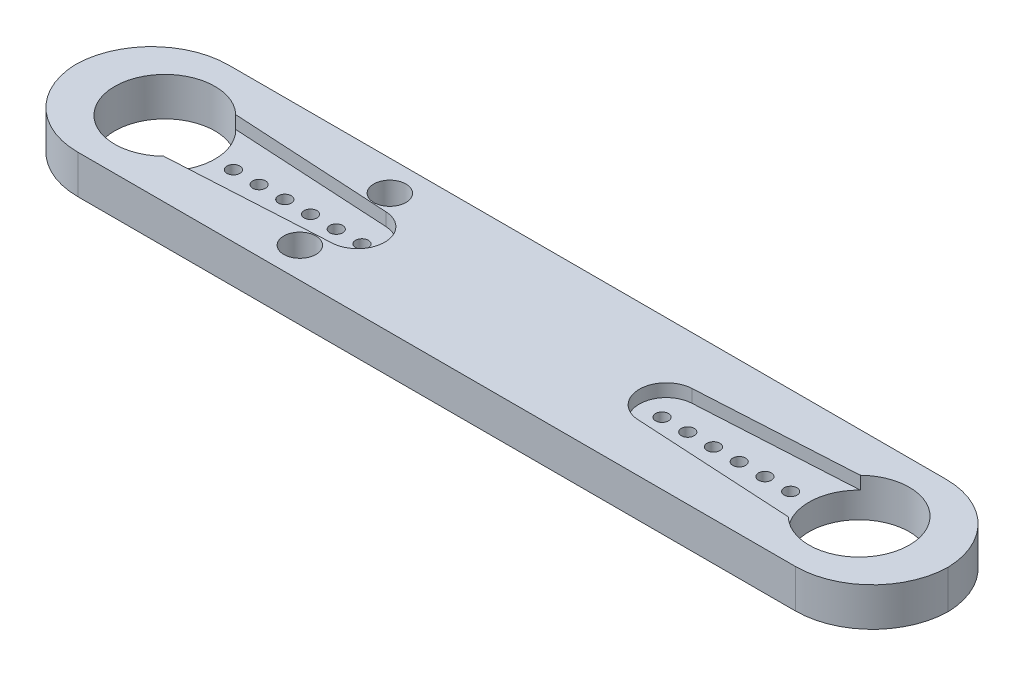
ISO-10303-21;
HEADER;
FILE_DESCRIPTION(('STEP AP214'),'2;1');
FILE_NAME('part.step','',(''),(''),'','','');
FILE_SCHEMA(('AUTOMOTIVE_DESIGN { 1 0 10303 214 1 1 1 1 }'));
ENDSEC;
DATA;
#1=APPLICATION_CONTEXT('core data for automotive mechanical design processes');
#2=APPLICATION_PROTOCOL_DEFINITION('international standard','automotive_design',2000,#1);
#3=PRODUCT_CONTEXT('',#1,'mechanical');
#4=PRODUCT('Part','Part','',(#3));
#5=PRODUCT_RELATED_PRODUCT_CATEGORY('part','',(#4));
#6=PRODUCT_DEFINITION_FORMATION('','',#4);
#7=PRODUCT_DEFINITION_CONTEXT('part definition',#1,'design');
#8=PRODUCT_DEFINITION('design','',#6,#7);
#9=PRODUCT_DEFINITION_SHAPE('','',#8);
#10=(LENGTH_UNIT() NAMED_UNIT(*) SI_UNIT(.MILLI.,.METRE.));
#11=(NAMED_UNIT(*) PLANE_ANGLE_UNIT() SI_UNIT($,.RADIAN.));
#12=(NAMED_UNIT(*) SI_UNIT($,.STERADIAN.) SOLID_ANGLE_UNIT());
#13=UNCERTAINTY_MEASURE_WITH_UNIT(LENGTH_MEASURE(1.E-05),#10,'distance_accuracy_value','');
#14=(GEOMETRIC_REPRESENTATION_CONTEXT(3) GLOBAL_UNCERTAINTY_ASSIGNED_CONTEXT((#13)) GLOBAL_UNIT_ASSIGNED_CONTEXT((#10,
#11,#12)) REPRESENTATION_CONTEXT('',''));
#15=CARTESIAN_POINT('',(0.,0.,0.));
#16=DIRECTION('',(0.,0.,1.));
#17=DIRECTION('',(1.,0.,0.));
#18=AXIS2_PLACEMENT_3D('',#15,#16,#17);
#19=CARTESIAN_POINT('',(0.106898980546491,3.,-1.89370424402151));
#20=DIRECTION('',(0.0563599445727909,0.,-0.998410515092741));
#21=DIRECTION('',(-0.998410515092741,0.,-0.0563599445727909));
#22=AXIS2_PLACEMENT_3D('',#19,#20,#21);
#23=PLANE('',#22);
#24=DIRECTION('',(0.,-1.,0.));
#25=VECTOR('',#24,1.);
#26=CARTESIAN_POINT('',(-15.948035413227,3.,-2.80000000000002));
#27=LINE('',#26,#25);
#28=CARTESIAN_POINT('',(-15.948035413227,3.,-2.80000000000002));
#29=VERTEX_POINT('',#28);
#30=CARTESIAN_POINT('',(-15.948035413227,2.,-2.80000000000002));
#31=VERTEX_POINT('',#30);
#32=EDGE_CURVE('E163',#29,#31,#27,.T.);
#33=ORIENTED_EDGE('',*,*,#32,.T.);
#34=DIRECTION('',(0.998410515092741,0.,0.0563599445727909));
#35=VECTOR('',#34,1.);
#36=CARTESIAN_POINT('',(0.106898980546491,2.,-1.89370424402151));
#37=LINE('',#36,#35);
#38=CARTESIAN_POINT('',(-3.54760872965789,2.,-2.10000000000002));
#39=VERTEX_POINT('',#38);
#40=EDGE_CURVE('E300',#31,#39,#37,.T.);
#41=ORIENTED_EDGE('',*,*,#40,.T.);
#42=DIRECTION('',(0.,-1.,0.));
#43=VECTOR('',#42,1.);
#44=CARTESIAN_POINT('',(-3.54760872965789,3.,-2.10000000000002));
#45=LINE('',#44,#43);
#46=CARTESIAN_POINT('',(-3.54760872965789,3.,-2.10000000000002));
#47=VERTEX_POINT('',#46);
#48=EDGE_CURVE('E172',#47,#39,#45,.T.);
#49=ORIENTED_EDGE('',*,*,#48,.F.);
#50=DIRECTION('',(0.998410515092741,0.,0.0563599445727909));
#51=VECTOR('',#50,1.);
#52=CARTESIAN_POINT('',(0.106898980546491,3.,-1.89370424402151));
#53=LINE('',#52,#51);
#54=EDGE_CURVE('E263',#29,#47,#53,.T.);
#55=ORIENTED_EDGE('',*,*,#54,.F.);
#56=EDGE_LOOP('',(#33,#41,#49,#55));
#57=FACE_BOUND('',#56,.T.);
#58=ADVANCED_FACE('F34',(#57),#23,.F.);
#59=CARTESIAN_POINT('',(-3.66615303764914,3.,0.));
#60=DIRECTION('',(0.,-1.,0.));
#61=DIRECTION('',(0.,0.,-1.));
#62=AXIS2_PLACEMENT_3D('',#59,#60,#61);
#63=CYLINDRICAL_SURFACE('',#62,2.10334323232259);
#64=ORIENTED_EDGE('',*,*,#48,.T.);
#65=CARTESIAN_POINT('',(-3.66615303764914,2.,0.));
#66=DIRECTION('',(0.,1.,0.));
#67=DIRECTION('',(0.,0.,1.));
#68=AXIS2_PLACEMENT_3D('',#65,#66,#67);
#69=CIRCLE('',#68,2.10334323232259);
#70=CARTESIAN_POINT('',(-3.54760872965789,2.,2.10000000000002));
#71=VERTEX_POINT('',#70);
#72=EDGE_CURVE('E302',#39,#71,#69,.F.);
#73=ORIENTED_EDGE('',*,*,#72,.T.);
#74=DIRECTION('',(0.,-1.,0.));
#75=VECTOR('',#74,1.);
#76=CARTESIAN_POINT('',(-3.54760872965789,3.,2.10000000000002));
#77=LINE('',#76,#75);
#78=CARTESIAN_POINT('',(-3.54760872965789,3.,2.10000000000002));
#79=VERTEX_POINT('',#78);
#80=EDGE_CURVE('E241',#79,#71,#77,.T.);
#81=ORIENTED_EDGE('',*,*,#80,.F.);
#82=CARTESIAN_POINT('',(-3.66615303764914,3.,0.));
#83=DIRECTION('',(0.,1.,0.));
#84=DIRECTION('',(0.,0.,1.));
#85=AXIS2_PLACEMENT_3D('',#82,#83,#84);
#86=CIRCLE('',#85,2.10334323232259);
#87=EDGE_CURVE('E261',#47,#79,#86,.F.);
#88=ORIENTED_EDGE('',*,*,#87,.F.);
#89=EDGE_LOOP('',(#64,#73,#81,#88));
#90=FACE_BOUND('',#89,.T.);
#91=ADVANCED_FACE('F399',(#90),#63,.F.);
#92=CARTESIAN_POINT('',(0.106898980546491,3.,1.89370424402151));
#93=DIRECTION('',(0.0563599445727909,0.,0.998410515092741));
#94=DIRECTION('',(0.998410515092741,0.,-0.0563599445727909));
#95=AXIS2_PLACEMENT_3D('',#92,#93,#94);
#96=PLANE('',#95);
#97=ORIENTED_EDGE('',*,*,#80,.T.);
#98=DIRECTION('',(-0.998410515092741,0.,0.0563599445727909));
#99=VECTOR('',#98,1.);
#100=CARTESIAN_POINT('',(0.106898980546491,2.,1.89370424402151));
#101=LINE('',#100,#99);
#102=CARTESIAN_POINT('',(-15.948035413227,2.,2.80000000000002));
#103=VERTEX_POINT('',#102);
#104=EDGE_CURVE('E224',#71,#103,#101,.T.);
#105=ORIENTED_EDGE('',*,*,#104,.T.);
#106=DIRECTION('',(0.,-1.,0.));
#107=VECTOR('',#106,1.);
#108=CARTESIAN_POINT('',(-15.948035413227,3.,2.80000000000002));
#109=LINE('',#108,#107);
#110=CARTESIAN_POINT('',(-15.948035413227,3.,2.80000000000002));
#111=VERTEX_POINT('',#110);
#112=EDGE_CURVE('E238',#111,#103,#109,.T.);
#113=ORIENTED_EDGE('',*,*,#112,.F.);
#114=DIRECTION('',(-0.998410515092741,0.,0.0563599445727909));
#115=VECTOR('',#114,1.);
#116=CARTESIAN_POINT('',(0.106898980546491,3.,1.89370424402151));
#117=LINE('',#116,#115);
#118=EDGE_CURVE('E259',#79,#111,#117,.T.);
#119=ORIENTED_EDGE('',*,*,#118,.F.);
#120=EDGE_LOOP('',(#97,#105,#113,#119));
#121=FACE_BOUND('',#120,.T.);
#122=ADVANCED_FACE('F405',(#121),#96,.F.);
#123=CARTESIAN_POINT('',(0.,3.,-5.86615357924814));
#124=DIRECTION('',(0.,0.,-1.));
#125=DIRECTION('',(-1.,0.,0.));
#126=AXIS2_PLACEMENT_3D('',#123,#124,#125);
#127=PLANE('',#126);
#128=DIRECTION('',(1.,0.,0.));
#129=VECTOR('',#128,1.);
#130=CARTESIAN_POINT('',(0.,3.,-5.86615357924814));
#131=LINE('',#130,#129);
#132=CARTESIAN_POINT('',(-19.5628098053266,3.,-5.86615357924814));
#133=VERTEX_POINT('',#132);
#134=CARTESIAN_POINT('',(36.2371901946734,3.,-5.86615357924814));
#135=VERTEX_POINT('',#134);
#136=EDGE_CURVE('E268',#133,#135,#131,.T.);
#137=ORIENTED_EDGE('',*,*,#136,.T.);
#138=DIRECTION('',(0.,-1.,0.));
#139=VECTOR('',#138,1.);
#140=CARTESIAN_POINT('',(36.2371901946734,3.,-5.86615357924814));
#141=LINE('',#140,#139);
#142=CARTESIAN_POINT('',(36.2371901946734,0.,-5.86615357924814));
#143=VERTEX_POINT('',#142);
#144=EDGE_CURVE('E171',#135,#143,#141,.T.);
#145=ORIENTED_EDGE('',*,*,#144,.T.);
#146=DIRECTION('',(1.,0.,0.));
#147=VECTOR('',#146,1.);
#148=CARTESIAN_POINT('',(0.,0.,-5.86615357924814));
#149=LINE('',#148,#147);
#150=CARTESIAN_POINT('',(-19.5628098053266,0.,-5.86615357924814));
#151=VERTEX_POINT('',#150);
#152=EDGE_CURVE('E211',#151,#143,#149,.T.);
#153=ORIENTED_EDGE('',*,*,#152,.F.);
#154=DIRECTION('',(0.,-1.,0.));
#155=VECTOR('',#154,1.);
#156=CARTESIAN_POINT('',(-19.5628098053266,3.,-5.86615357924814));
#157=LINE('',#156,#155);
#158=EDGE_CURVE('E169',#151,#133,#157,.F.);
#159=ORIENTED_EDGE('',*,*,#158,.T.);
#160=EDGE_LOOP('',(#137,#145,#153,#159));
#161=FACE_BOUND('',#160,.T.);
#162=ADVANCED_FACE('F215',(#161),#127,.T.);
#163=CARTESIAN_POINT('',(-0.0539337558058955,3.,-0.955430835200775));
#164=DIRECTION('',(0.0563599445727901,0.,0.998410515092741));
#165=DIRECTION('',(0.998410515092741,0.,-0.0563599445727901));
#166=AXIS2_PLACEMENT_3D('',#163,#164,#165);
#167=PLANE('',#166);
#168=DIRECTION('',(-0.998410515092741,0.,0.0563599445727901));
#169=VECTOR('',#168,1.);
#170=CARTESIAN_POINT('',(-0.0539337558058955,2.,-0.955430835200775));
#171=LINE('',#170,#169);
#172=CARTESIAN_POINT('',(32.6224158025738,2.,-2.80000000000001));
#173=VERTEX_POINT('',#172);
#174=CARTESIAN_POINT('',(20.2219891190047,2.,-2.10000000000003));
#175=VERTEX_POINT('',#174);
#176=EDGE_CURVE('E147',#173,#175,#171,.T.);
#177=ORIENTED_EDGE('',*,*,#176,.F.);
#178=DIRECTION('',(0.,-1.,0.));
#179=VECTOR('',#178,1.);
#180=CARTESIAN_POINT('',(32.6224158025738,3.,-2.80000000000001));
#181=LINE('',#180,#179);
#182=CARTESIAN_POINT('',(32.6224158025738,3.,-2.80000000000001));
#183=VERTEX_POINT('',#182);
#184=EDGE_CURVE('E144',#183,#173,#181,.T.);
#185=ORIENTED_EDGE('',*,*,#184,.F.);
#186=DIRECTION('',(-0.998410515092741,0.,0.0563599445727901));
#187=VECTOR('',#186,1.);
#188=CARTESIAN_POINT('',(-0.0539337558058955,3.,-0.955430835200775));
#189=LINE('',#188,#187);
#190=CARTESIAN_POINT('',(20.2219891190047,3.,-2.10000000000003));
#191=VERTEX_POINT('',#190);
#192=EDGE_CURVE('E236',#183,#191,#189,.T.);
#193=ORIENTED_EDGE('',*,*,#192,.T.);
#194=DIRECTION('',(0.,-1.,0.));
#195=VECTOR('',#194,1.);
#196=CARTESIAN_POINT('',(20.2219891190047,3.,-2.10000000000003));
#197=LINE('',#196,#195);
#198=EDGE_CURVE('E165',#191,#175,#197,.T.);
#199=ORIENTED_EDGE('',*,*,#198,.T.);
#200=EDGE_LOOP('',(#177,#185,#193,#199));
#201=FACE_BOUND('',#200,.T.);
#202=ADVANCED_FACE('F418',(#201),#167,.T.);
#203=CARTESIAN_POINT('',(35.3371901946734,3.,0.));
#204=DIRECTION('',(0.,-1.,0.));
#205=DIRECTION('',(0.,0.,-1.));
#206=AXIS2_PLACEMENT_3D('',#203,#204,#205);
#207=CYLINDRICAL_SURFACE('',#206,3.9);
#208=CARTESIAN_POINT('',(35.3371901946734,0.,0.));
#209=DIRECTION('',(0.,1.,0.));
#210=DIRECTION('',(0.,0.,1.));
#211=AXIS2_PLACEMENT_3D('',#208,#209,#210);
#212=CIRCLE('',#211,3.9);
#213=CARTESIAN_POINT('',(35.3371901946734,0.,3.89999999999999));
#214=VERTEX_POINT('',#213);
#215=EDGE_CURVE('E218',#214,#214,#212,.F.);
#216=ORIENTED_EDGE('',*,*,#215,.T.);
#217=EDGE_LOOP('',(#216));
#218=FACE_BOUND('',#217,.T.);
#219=ORIENTED_EDGE('',*,*,#184,.T.);
#220=CARTESIAN_POINT('',(35.3371901946734,2.,0.));
#221=DIRECTION('',(0.,1.,0.));
#222=DIRECTION('',(0.,0.,1.));
#223=AXIS2_PLACEMENT_3D('',#220,#221,#222);
#224=CIRCLE('',#223,3.9);
#225=CARTESIAN_POINT('',(32.6224158025738,2.,2.80000000000001));
#226=VERTEX_POINT('',#225);
#227=EDGE_CURVE('E137',#226,#173,#224,.F.);
#228=ORIENTED_EDGE('',*,*,#227,.F.);
#229=DIRECTION('',(0.,-1.,0.));
#230=VECTOR('',#229,1.);
#231=CARTESIAN_POINT('',(32.6224158025738,3.,2.80000000000001));
#232=LINE('',#231,#230);
#233=CARTESIAN_POINT('',(32.6224158025738,3.,2.80000000000001));
#234=VERTEX_POINT('',#233);
#235=EDGE_CURVE('E142',#234,#226,#232,.T.);
#236=ORIENTED_EDGE('',*,*,#235,.F.);
#237=CARTESIAN_POINT('',(35.3371901946734,3.,0.));
#238=DIRECTION('',(0.,1.,0.));
#239=DIRECTION('',(0.,0.,1.));
#240=AXIS2_PLACEMENT_3D('',#237,#238,#239);
#241=CIRCLE('',#240,3.9);
#242=EDGE_CURVE('E274',#183,#234,#241,.F.);
#243=ORIENTED_EDGE('',*,*,#242,.F.);
#244=EDGE_LOOP('',(#219,#228,#236,#243));
#245=FACE_BOUND('',#244,.T.);
#246=ADVANCED_FACE('F139',(#218,#245),#207,.F.);
#247=CARTESIAN_POINT('',(-0.0539337558058955,3.,0.955430835200775));
#248=DIRECTION('',(0.0563599445727901,0.,-0.998410515092741));
#249=DIRECTION('',(-0.998410515092741,0.,-0.0563599445727901));
#250=AXIS2_PLACEMENT_3D('',#247,#248,#249);
#251=PLANE('',#250);
#252=DIRECTION('',(0.998410515092741,0.,0.0563599445727901));
#253=VECTOR('',#252,1.);
#254=CARTESIAN_POINT('',(-0.0539337558058955,2.,0.955430835200775));
#255=LINE('',#254,#253);
#256=CARTESIAN_POINT('',(20.2219891190047,2.,2.10000000000003));
#257=VERTEX_POINT('',#256);
#258=EDGE_CURVE('E148',#257,#226,#255,.T.);
#259=ORIENTED_EDGE('',*,*,#258,.F.);
#260=DIRECTION('',(0.,-1.,0.));
#261=VECTOR('',#260,1.);
#262=CARTESIAN_POINT('',(20.2219891190047,3.,2.10000000000003));
#263=LINE('',#262,#261);
#264=CARTESIAN_POINT('',(20.2219891190047,3.,2.10000000000003));
#265=VERTEX_POINT('',#264);
#266=EDGE_CURVE('E161',#265,#257,#263,.T.);
#267=ORIENTED_EDGE('',*,*,#266,.F.);
#268=DIRECTION('',(0.998410515092741,0.,0.0563599445727901));
#269=VECTOR('',#268,1.);
#270=CARTESIAN_POINT('',(-0.0539337558058955,3.,0.955430835200775));
#271=LINE('',#270,#269);
#272=EDGE_CURVE('E160',#265,#234,#271,.T.);
#273=ORIENTED_EDGE('',*,*,#272,.T.);
#274=ORIENTED_EDGE('',*,*,#235,.T.);
#275=EDGE_LOOP('',(#259,#267,#273,#274));
#276=FACE_BOUND('',#275,.T.);
#277=ADVANCED_FACE('F158',(#276),#251,.T.);
#278=CARTESIAN_POINT('',(-4.66280980532662,3.,-3.5));
#279=DIRECTION('',(0.,-1.,0.));
#280=DIRECTION('',(0.,0.,-1.));
#281=AXIS2_PLACEMENT_3D('',#278,#279,#280);
#282=CYLINDRICAL_SURFACE('',#281,1.25);
#283=CARTESIAN_POINT('',(-4.66280980532662,3.,-3.5));
#284=DIRECTION('',(0.,1.,0.));
#285=DIRECTION('',(0.,0.,1.));
#286=AXIS2_PLACEMENT_3D('',#283,#284,#285);
#287=CIRCLE('',#286,1.25);
#288=CARTESIAN_POINT('',(-4.66280980532662,3.,-2.25));
#289=VERTEX_POINT('',#288);
#290=EDGE_CURVE('E250',#289,#289,#287,.T.);
#291=ORIENTED_EDGE('',*,*,#290,.T.);
#292=EDGE_LOOP('',(#291));
#293=FACE_BOUND('',#292,.T.);
#294=CARTESIAN_POINT('',(-4.66280980532662,0.,-3.5));
#295=DIRECTION('',(0.,1.,0.));
#296=DIRECTION('',(0.,0.,1.));
#297=AXIS2_PLACEMENT_3D('',#294,#295,#296);
#298=CIRCLE('',#297,1.25);
#299=CARTESIAN_POINT('',(-4.66280980532662,0.,-2.25));
#300=VERTEX_POINT('',#299);
#301=EDGE_CURVE('E230',#300,#300,#298,.T.);
#302=ORIENTED_EDGE('',*,*,#301,.F.);
#303=EDGE_LOOP('',(#302));
#304=FACE_BOUND('',#303,.T.);
#305=ADVANCED_FACE('F425',(#293,#304),#282,.F.);
#306=CARTESIAN_POINT('',(-18.6628098053266,3.,0.));
#307=DIRECTION('',(0.,-1.,0.));
#308=DIRECTION('',(0.,0.,-1.));
#309=AXIS2_PLACEMENT_3D('',#306,#307,#308);
#310=CYLINDRICAL_SURFACE('',#309,3.9);
#311=CARTESIAN_POINT('',(-18.6628098053266,0.,0.));
#312=DIRECTION('',(0.,1.,0.));
#313=DIRECTION('',(0.,0.,1.));
#314=AXIS2_PLACEMENT_3D('',#311,#312,#313);
#315=CIRCLE('',#314,3.9);
#316=CARTESIAN_POINT('',(-18.6628098053266,0.,3.9));
#317=VERTEX_POINT('',#316);
#318=EDGE_CURVE('E221',#317,#317,#315,.T.);
#319=ORIENTED_EDGE('',*,*,#318,.F.);
#320=EDGE_LOOP('',(#319));
#321=FACE_BOUND('',#320,.T.);
#322=CARTESIAN_POINT('',(-18.6628098053266,2.,0.));
#323=DIRECTION('',(0.,1.,0.));
#324=DIRECTION('',(0.,0.,1.));
#325=AXIS2_PLACEMENT_3D('',#322,#323,#324);
#326=CIRCLE('',#325,3.9);
#327=EDGE_CURVE('E297',#103,#31,#326,.T.);
#328=ORIENTED_EDGE('',*,*,#327,.T.);
#329=ORIENTED_EDGE('',*,*,#32,.F.);
#330=CARTESIAN_POINT('',(-18.6628098053266,3.,0.));
#331=DIRECTION('',(0.,1.,0.));
#332=DIRECTION('',(0.,0.,1.));
#333=AXIS2_PLACEMENT_3D('',#330,#331,#332);
#334=CIRCLE('',#333,3.9);
#335=EDGE_CURVE('E254',#29,#111,#334,.T.);
#336=ORIENTED_EDGE('',*,*,#335,.T.);
#337=ORIENTED_EDGE('',*,*,#112,.T.);
#338=EDGE_LOOP('',(#328,#329,#336,#337));
#339=FACE_BOUND('',#338,.T.);
#340=ADVANCED_FACE('F414',(#321,#339),#310,.F.);
#341=CARTESIAN_POINT('',(0.,3.,5.86615357924815));
#342=DIRECTION('',(0.,0.,-1.));
#343=DIRECTION('',(-1.,0.,0.));
#344=AXIS2_PLACEMENT_3D('',#341,#342,#343);
#345=PLANE('',#344);
#346=DIRECTION('',(1.,0.,0.));
#347=VECTOR('',#346,1.);
#348=CARTESIAN_POINT('',(0.,0.,5.86615357924815));
#349=LINE('',#348,#347);
#350=CARTESIAN_POINT('',(-19.5628098053266,0.,5.86615357924815));
#351=VERTEX_POINT('',#350);
#352=CARTESIAN_POINT('',(36.2371901946734,0.,5.86615357924813));
#353=VERTEX_POINT('',#352);
#354=EDGE_CURVE('E217',#351,#353,#349,.T.);
#355=ORIENTED_EDGE('',*,*,#354,.T.);
#356=DIRECTION('',(0.,-1.,0.));
#357=VECTOR('',#356,1.);
#358=CARTESIAN_POINT('',(36.2371901946734,3.,5.86615357924813));
#359=LINE('',#358,#357);
#360=CARTESIAN_POINT('',(36.2371901946734,3.,5.86615357924813));
#361=VERTEX_POINT('',#360);
#362=EDGE_CURVE('E11',#353,#361,#359,.F.);
#363=ORIENTED_EDGE('',*,*,#362,.T.);
#364=DIRECTION('',(1.,0.,0.));
#365=VECTOR('',#364,1.);
#366=CARTESIAN_POINT('',(0.,3.,5.86615357924815));
#367=LINE('',#366,#365);
#368=CARTESIAN_POINT('',(-19.5628098053266,3.,5.86615357924815));
#369=VERTEX_POINT('',#368);
#370=EDGE_CURVE('E266',#369,#361,#367,.T.);
#371=ORIENTED_EDGE('',*,*,#370,.F.);
#372=DIRECTION('',(0.,-1.,0.));
#373=VECTOR('',#372,1.);
#374=CARTESIAN_POINT('',(-19.5628098053266,3.,5.86615357924815));
#375=LINE('',#374,#373);
#376=EDGE_CURVE('E43',#369,#351,#375,.T.);
#377=ORIENTED_EDGE('',*,*,#376,.T.);
#378=EDGE_LOOP('',(#355,#363,#371,#377));
#379=FACE_BOUND('',#378,.T.);
#380=ADVANCED_FACE('F410',(#379),#345,.F.);
#381=CARTESIAN_POINT('',(20.3405334269959,3.,0.));
#382=DIRECTION('',(0.,-1.,0.));
#383=DIRECTION('',(0.,0.,-1.));
#384=AXIS2_PLACEMENT_3D('',#381,#382,#383);
#385=CYLINDRICAL_SURFACE('',#384,2.10334323232259);
#386=CARTESIAN_POINT('',(20.3405334269959,2.,0.));
#387=DIRECTION('',(0.,1.,0.));
#388=DIRECTION('',(0.,0.,1.));
#389=AXIS2_PLACEMENT_3D('',#386,#387,#388);
#390=CIRCLE('',#389,2.10334323232259);
#391=EDGE_CURVE('E153',#175,#257,#390,.T.);
#392=ORIENTED_EDGE('',*,*,#391,.F.);
#393=ORIENTED_EDGE('',*,*,#198,.F.);
#394=CARTESIAN_POINT('',(20.3405334269959,3.,0.));
#395=DIRECTION('',(0.,1.,0.));
#396=DIRECTION('',(0.,0.,1.));
#397=AXIS2_PLACEMENT_3D('',#394,#395,#396);
#398=CIRCLE('',#397,2.10334323232259);
#399=EDGE_CURVE('E270',#191,#265,#398,.T.);
#400=ORIENTED_EDGE('',*,*,#399,.T.);
#401=ORIENTED_EDGE('',*,*,#266,.T.);
#402=EDGE_LOOP('',(#392,#393,#400,#401));
#403=FACE_BOUND('',#402,.T.);
#404=ADVANCED_FACE('F413',(#403),#385,.F.);
#405=CARTESIAN_POINT('',(-4.66280980532661,3.,3.5));
#406=DIRECTION('',(0.,-1.,0.));
#407=DIRECTION('',(0.,0.,-1.));
#408=AXIS2_PLACEMENT_3D('',#405,#406,#407);
#409=CYLINDRICAL_SURFACE('',#408,1.25);
#410=CARTESIAN_POINT('',(-4.66280980532661,3.,3.5));
#411=DIRECTION('',(0.,1.,0.));
#412=DIRECTION('',(0.,0.,1.));
#413=AXIS2_PLACEMENT_3D('',#410,#411,#412);
#414=CIRCLE('',#413,1.25);
#415=CARTESIAN_POINT('',(-4.66280980532661,3.,4.75));
#416=VERTEX_POINT('',#415);
#417=EDGE_CURVE('E246',#416,#416,#414,.F.);
#418=ORIENTED_EDGE('',*,*,#417,.F.);
#419=EDGE_LOOP('',(#418));
#420=FACE_BOUND('',#419,.T.);
#421=CARTESIAN_POINT('',(-4.66280980532661,0.,3.5));
#422=DIRECTION('',(0.,1.,0.));
#423=DIRECTION('',(0.,0.,1.));
#424=AXIS2_PLACEMENT_3D('',#421,#422,#423);
#425=CIRCLE('',#424,1.25);
#426=CARTESIAN_POINT('',(-4.66280980532661,0.,4.75));
#427=VERTEX_POINT('',#426);
#428=EDGE_CURVE('E233',#427,#427,#425,.F.);
#429=ORIENTED_EDGE('',*,*,#428,.T.);
#430=EDGE_LOOP('',(#429));
#431=FACE_BOUND('',#430,.T.);
#432=ADVANCED_FACE('F421',(#420,#431),#409,.F.);
#433=CARTESIAN_POINT('',(0.,3.,0.));
#434=DIRECTION('',(0.,1.,0.));
#435=DIRECTION('',(0.,0.,1.));
#436=AXIS2_PLACEMENT_3D('',#433,#434,#435);
#437=PLANE('',#436);
#438=ORIENTED_EDGE('',*,*,#192,.F.);
#439=ORIENTED_EDGE('',*,*,#242,.T.);
#440=ORIENTED_EDGE('',*,*,#272,.F.);
#441=ORIENTED_EDGE('',*,*,#399,.F.);
#442=EDGE_LOOP('',(#438,#439,#440,#441));
#443=FACE_BOUND('',#442,.T.);
#444=CARTESIAN_POINT('',(36.2371901946734,3.,-0.133846420751873));
#445=DIRECTION('',(0.,1.,0.));
#446=DIRECTION('',(0.,0.,1.));
#447=AXIS2_PLACEMENT_3D('',#444,#445,#446);
#448=CIRCLE('',#447,6.);
#449=CARTESIAN_POINT('',(42.2356971035343,3.,0.));
#450=VERTEX_POINT('',#449);
#451=EDGE_CURVE('E51',#361,#450,#448,.T.);
#452=ORIENTED_EDGE('',*,*,#451,.T.);
#453=CARTESIAN_POINT('',(36.2371901946734,3.,0.133846420751856));
#454=DIRECTION('',(0.,1.,0.));
#455=DIRECTION('',(0.,0.,1.));
#456=AXIS2_PLACEMENT_3D('',#453,#454,#455);
#457=CIRCLE('',#456,6.);
#458=EDGE_CURVE('E187',#450,#135,#457,.T.);
#459=ORIENTED_EDGE('',*,*,#458,.T.);
#460=ORIENTED_EDGE('',*,*,#136,.F.);
#461=CARTESIAN_POINT('',(-19.5628098053266,3.,0.133846420751863));
#462=DIRECTION('',(0.,1.,0.));
#463=DIRECTION('',(0.,0.,1.));
#464=AXIS2_PLACEMENT_3D('',#461,#462,#463);
#465=CIRCLE('',#464,6.);
#466=CARTESIAN_POINT('',(-25.5613167141875,3.,0.));
#467=VERTEX_POINT('',#466);
#468=EDGE_CURVE('E58',#133,#467,#465,.T.);
#469=ORIENTED_EDGE('',*,*,#468,.T.);
#470=CARTESIAN_POINT('',(-19.5628098053266,3.,-0.133846420751846));
#471=DIRECTION('',(0.,1.,0.));
#472=DIRECTION('',(0.,0.,1.));
#473=AXIS2_PLACEMENT_3D('',#470,#471,#472);
#474=CIRCLE('',#473,6.);
#475=EDGE_CURVE('E184',#467,#369,#474,.T.);
#476=ORIENTED_EDGE('',*,*,#475,.T.);
#477=ORIENTED_EDGE('',*,*,#370,.T.);
#478=EDGE_LOOP('',(#452,#459,#460,#469,#476,#477));
#479=FACE_BOUND('',#478,.T.);
#480=ORIENTED_EDGE('',*,*,#54,.T.);
#481=ORIENTED_EDGE('',*,*,#87,.T.);
#482=ORIENTED_EDGE('',*,*,#118,.T.);
#483=ORIENTED_EDGE('',*,*,#335,.F.);
#484=EDGE_LOOP('',(#480,#481,#482,#483));
#485=FACE_BOUND('',#484,.T.);
#486=ORIENTED_EDGE('',*,*,#290,.F.);
#487=EDGE_LOOP('',(#486));
#488=FACE_BOUND('',#487,.T.);
#489=ORIENTED_EDGE('',*,*,#417,.T.);
#490=EDGE_LOOP('',(#489));
#491=FACE_BOUND('',#490,.T.);
#492=ADVANCED_FACE('F367',(#443,#479,#485,#488,#491),#437,.T.);
#493=CARTESIAN_POINT('',(0.,0.,0.));
#494=DIRECTION('',(0.,1.,0.));
#495=DIRECTION('',(0.,0.,1.));
#496=AXIS2_PLACEMENT_3D('',#493,#494,#495);
#497=PLANE('',#496);
#498=ORIENTED_EDGE('',*,*,#215,.F.);
#499=EDGE_LOOP('',(#498));
#500=FACE_BOUND('',#499,.T.);
#501=ORIENTED_EDGE('',*,*,#152,.T.);
#502=CARTESIAN_POINT('',(36.2371901946734,0.,0.133846420751856));
#503=DIRECTION('',(0.,1.,0.));
#504=DIRECTION('',(0.,0.,1.));
#505=AXIS2_PLACEMENT_3D('',#502,#503,#504);
#506=CIRCLE('',#505,6.);
#507=CARTESIAN_POINT('',(42.2356971035343,0.,0.));
#508=VERTEX_POINT('',#507);
#509=EDGE_CURVE('E181',#143,#508,#506,.F.);
#510=ORIENTED_EDGE('',*,*,#509,.T.);
#511=CARTESIAN_POINT('',(36.2371901946734,0.,-0.133846420751873));
#512=DIRECTION('',(0.,1.,0.));
#513=DIRECTION('',(0.,0.,1.));
#514=AXIS2_PLACEMENT_3D('',#511,#512,#513);
#515=CIRCLE('',#514,6.);
#516=EDGE_CURVE('E179',#508,#353,#515,.F.);
#517=ORIENTED_EDGE('',*,*,#516,.T.);
#518=ORIENTED_EDGE('',*,*,#354,.F.);
#519=CARTESIAN_POINT('',(-19.5628098053266,0.,-0.133846420751846));
#520=DIRECTION('',(0.,1.,0.));
#521=DIRECTION('',(0.,0.,1.));
#522=AXIS2_PLACEMENT_3D('',#519,#520,#521);
#523=CIRCLE('',#522,6.);
#524=CARTESIAN_POINT('',(-25.5613167141875,0.,0.));
#525=VERTEX_POINT('',#524);
#526=EDGE_CURVE('E177',#351,#525,#523,.F.);
#527=ORIENTED_EDGE('',*,*,#526,.T.);
#528=CARTESIAN_POINT('',(-19.5628098053266,0.,0.133846420751863));
#529=DIRECTION('',(0.,1.,0.));
#530=DIRECTION('',(0.,0.,1.));
#531=AXIS2_PLACEMENT_3D('',#528,#529,#530);
#532=CIRCLE('',#531,6.);
#533=EDGE_CURVE('E175',#525,#151,#532,.F.);
#534=ORIENTED_EDGE('',*,*,#533,.T.);
#535=EDGE_LOOP('',(#501,#510,#517,#518,#527,#534));
#536=FACE_BOUND('',#535,.T.);
#537=ORIENTED_EDGE('',*,*,#318,.T.);
#538=EDGE_LOOP('',(#537));
#539=FACE_BOUND('',#538,.T.);
#540=ORIENTED_EDGE('',*,*,#301,.T.);
#541=EDGE_LOOP('',(#540));
#542=FACE_BOUND('',#541,.T.);
#543=ORIENTED_EDGE('',*,*,#428,.F.);
#544=EDGE_LOOP('',(#543));
#545=FACE_BOUND('',#544,.T.);
#546=CARTESIAN_POINT('',(-13.3314008037869,0.,0.));
#547=DIRECTION('',(0.,1.,0.));
#548=DIRECTION('',(0.,0.,1.));
#549=AXIS2_PLACEMENT_3D('',#546,#547,#548);
#550=CIRCLE('',#549,0.500000000000001);
#551=CARTESIAN_POINT('',(-13.3314008037869,0.,0.500000000000071));
#552=VERTEX_POINT('',#551);
#553=EDGE_CURVE('E293',#552,#552,#550,.T.);
#554=ORIENTED_EDGE('',*,*,#553,.T.);
#555=EDGE_LOOP('',(#554));
#556=FACE_BOUND('',#555,.T.);
#557=CARTESIAN_POINT('',(-11.3314008037869,0.,0.));
#558=DIRECTION('',(0.,1.,0.));
#559=DIRECTION('',(0.,0.,1.));
#560=AXIS2_PLACEMENT_3D('',#557,#558,#559);
#561=CIRCLE('',#560,0.500000000000001);
#562=CARTESIAN_POINT('',(-11.3314008037869,0.,0.500000000000057));
#563=VERTEX_POINT('',#562);
#564=EDGE_CURVE('E290',#563,#563,#561,.T.);
#565=ORIENTED_EDGE('',*,*,#564,.T.);
#566=EDGE_LOOP('',(#565));
#567=FACE_BOUND('',#566,.T.);
#568=CARTESIAN_POINT('',(-9.3314008037869,0.,0.));
#569=DIRECTION('',(0.,1.,0.));
#570=DIRECTION('',(0.,0.,1.));
#571=AXIS2_PLACEMENT_3D('',#568,#569,#570);
#572=CIRCLE('',#571,0.500000000000001);
#573=CARTESIAN_POINT('',(-9.3314008037869,0.,0.500000000000043));
#574=VERTEX_POINT('',#573);
#575=EDGE_CURVE('E287',#574,#574,#572,.T.);
#576=ORIENTED_EDGE('',*,*,#575,.T.);
#577=EDGE_LOOP('',(#576));
#578=FACE_BOUND('',#577,.T.);
#579=CARTESIAN_POINT('',(-7.3314008037869,0.,0.));
#580=DIRECTION('',(0.,1.,0.));
#581=DIRECTION('',(0.,0.,1.));
#582=AXIS2_PLACEMENT_3D('',#579,#580,#581);
#583=CIRCLE('',#582,0.500000000000001);
#584=CARTESIAN_POINT('',(-7.3314008037869,0.,0.500000000000029));
#585=VERTEX_POINT('',#584);
#586=EDGE_CURVE('E284',#585,#585,#583,.T.);
#587=ORIENTED_EDGE('',*,*,#586,.T.);
#588=EDGE_LOOP('',(#587));
#589=FACE_BOUND('',#588,.T.);
#590=CARTESIAN_POINT('',(-5.3314008037869,0.,0.));
#591=DIRECTION('',(0.,1.,0.));
#592=DIRECTION('',(0.,0.,1.));
#593=AXIS2_PLACEMENT_3D('',#590,#591,#592);
#594=CIRCLE('',#593,0.5);
#595=CARTESIAN_POINT('',(-5.3314008037869,0.,0.500000000000014));
#596=VERTEX_POINT('',#595);
#597=EDGE_CURVE('E281',#596,#596,#594,.T.);
#598=ORIENTED_EDGE('',*,*,#597,.T.);
#599=EDGE_LOOP('',(#598));
#600=FACE_BOUND('',#599,.T.);
#601=CARTESIAN_POINT('',(-3.3314008037869,0.,0.));
#602=DIRECTION('',(0.,1.,0.));
#603=DIRECTION('',(0.,0.,1.));
#604=AXIS2_PLACEMENT_3D('',#601,#602,#603);
#605=CIRCLE('',#604,0.5);
#606=CARTESIAN_POINT('',(-3.3314008037869,0.,0.5));
#607=VERTEX_POINT('',#606);
#608=EDGE_CURVE('E277',#607,#607,#605,.T.);
#609=ORIENTED_EDGE('',*,*,#608,.T.);
#610=EDGE_LOOP('',(#609));
#611=FACE_BOUND('',#610,.T.);
#612=CARTESIAN_POINT('',(20.0057811931337,0.,0.));
#613=DIRECTION('',(0.,1.,0.));
#614=DIRECTION('',(0.,0.,1.));
#615=AXIS2_PLACEMENT_3D('',#612,#613,#614);
#616=CIRCLE('',#615,0.499999999999999);
#617=CARTESIAN_POINT('',(20.0057811931337,0.,0.499999999999996));
#618=VERTEX_POINT('',#617);
#619=EDGE_CURVE('E192',#618,#618,#616,.F.);
#620=ORIENTED_EDGE('',*,*,#619,.F.);
#621=EDGE_LOOP('',(#620));
#622=FACE_BOUND('',#621,.T.);
#623=CARTESIAN_POINT('',(24.0057811931337,0.,0.));
#624=DIRECTION('',(0.,1.,0.));
#625=DIRECTION('',(0.,0.,1.));
#626=AXIS2_PLACEMENT_3D('',#623,#624,#625);
#627=CIRCLE('',#626,0.499999999999995);
#628=CARTESIAN_POINT('',(24.0057811931337,0.,0.500000000000019));
#629=VERTEX_POINT('',#628);
#630=EDGE_CURVE('E196',#629,#629,#627,.F.);
#631=ORIENTED_EDGE('',*,*,#630,.F.);
#632=EDGE_LOOP('',(#631));
#633=FACE_BOUND('',#632,.T.);
#634=CARTESIAN_POINT('',(28.0057811931337,0.,0.));
#635=DIRECTION('',(0.,1.,0.));
#636=DIRECTION('',(0.,0.,1.));
#637=AXIS2_PLACEMENT_3D('',#634,#635,#636);
#638=CIRCLE('',#637,0.499999999999999);
#639=CARTESIAN_POINT('',(28.0057811931337,0.,0.50000000000005));
#640=VERTEX_POINT('',#639);
#641=EDGE_CURVE('E331',#640,#640,#638,.F.);
#642=ORIENTED_EDGE('',*,*,#641,.F.);
#643=EDGE_LOOP('',(#642));
#644=FACE_BOUND('',#643,.T.);
#645=CARTESIAN_POINT('',(30.0057811931337,0.,0.));
#646=DIRECTION('',(0.,1.,0.));
#647=DIRECTION('',(0.,0.,1.));
#648=AXIS2_PLACEMENT_3D('',#645,#646,#647);
#649=CIRCLE('',#648,0.499999999999992);
#650=CARTESIAN_POINT('',(30.0057811931337,0.,0.500000000000056));
#651=VERTEX_POINT('',#650);
#652=EDGE_CURVE('E328',#651,#651,#649,.F.);
#653=ORIENTED_EDGE('',*,*,#652,.F.);
#654=EDGE_LOOP('',(#653));
#655=FACE_BOUND('',#654,.T.);
#656=CARTESIAN_POINT('',(26.0057811931337,0.,0.));
#657=DIRECTION('',(0.,1.,0.));
#658=DIRECTION('',(0.,0.,1.));
#659=AXIS2_PLACEMENT_3D('',#656,#657,#658);
#660=CIRCLE('',#659,0.50000000000001);
#661=CARTESIAN_POINT('',(26.0057811931337,0.,0.500000000000048));
#662=VERTEX_POINT('',#661);
#663=EDGE_CURVE('E325',#662,#662,#660,.F.);
#664=ORIENTED_EDGE('',*,*,#663,.F.);
#665=EDGE_LOOP('',(#664));
#666=FACE_BOUND('',#665,.T.);
#667=CARTESIAN_POINT('',(22.0057811931337,0.,0.));
#668=DIRECTION('',(0.,1.,0.));
#669=DIRECTION('',(0.,0.,1.));
#670=AXIS2_PLACEMENT_3D('',#667,#668,#669);
#671=CIRCLE('',#670,0.499999999999999);
#672=CARTESIAN_POINT('',(22.0057811931337,0.,0.50000000000001));
#673=VERTEX_POINT('',#672);
#674=EDGE_CURVE('E321',#673,#673,#671,.F.);
#675=ORIENTED_EDGE('',*,*,#674,.F.);
#676=EDGE_LOOP('',(#675));
#677=FACE_BOUND('',#676,.T.);
#678=ADVANCED_FACE('F209',(#500,#536,#539,#542,#545,#556,#567,#578,#589,#600,#611,#622,#633,
#644,#655,#666,#677),#497,.F.);
#679=CARTESIAN_POINT('',(-3.3314008037869,2.,0.));
#680=DIRECTION('',(0.,-1.,0.));
#681=DIRECTION('',(0.,0.,-1.));
#682=AXIS2_PLACEMENT_3D('',#679,#680,#681);
#683=CYLINDRICAL_SURFACE('',#682,0.5);
#684=CARTESIAN_POINT('',(-3.3314008037869,2.,0.));
#685=DIRECTION('',(0.,1.,0.));
#686=DIRECTION('',(0.,0.,1.));
#687=AXIS2_PLACEMENT_3D('',#684,#685,#686);
#688=CIRCLE('',#687,0.5);
#689=CARTESIAN_POINT('',(-3.3314008037869,2.,0.5));
#690=VERTEX_POINT('',#689);
#691=EDGE_CURVE('E304',#690,#690,#688,.T.);
#692=ORIENTED_EDGE('',*,*,#691,.T.);
#693=EDGE_LOOP('',(#692));
#694=FACE_BOUND('',#693,.T.);
#695=ORIENTED_EDGE('',*,*,#608,.F.);
#696=EDGE_LOOP('',(#695));
#697=FACE_BOUND('',#696,.T.);
#698=ADVANCED_FACE('F366',(#694,#697),#683,.F.);
#699=CARTESIAN_POINT('',(-5.3314008037869,2.,0.));
#700=DIRECTION('',(0.,-1.,0.));
#701=DIRECTION('',(0.,0.,-1.));
#702=AXIS2_PLACEMENT_3D('',#699,#700,#701);
#703=CYLINDRICAL_SURFACE('',#702,0.5);
#704=CARTESIAN_POINT('',(-5.3314008037869,2.,0.));
#705=DIRECTION('',(0.,1.,0.));
#706=DIRECTION('',(0.,0.,1.));
#707=AXIS2_PLACEMENT_3D('',#704,#705,#706);
#708=CIRCLE('',#707,0.5);
#709=CARTESIAN_POINT('',(-5.3314008037869,2.,0.500000000000014));
#710=VERTEX_POINT('',#709);
#711=EDGE_CURVE('E307',#710,#710,#708,.T.);
#712=ORIENTED_EDGE('',*,*,#711,.T.);
#713=EDGE_LOOP('',(#712));
#714=FACE_BOUND('',#713,.T.);
#715=ORIENTED_EDGE('',*,*,#597,.F.);
#716=EDGE_LOOP('',(#715));
#717=FACE_BOUND('',#716,.T.);
#718=ADVANCED_FACE('F537',(#714,#717),#703,.F.);
#719=CARTESIAN_POINT('',(-7.3314008037869,2.,0.));
#720=DIRECTION('',(0.,-1.,0.));
#721=DIRECTION('',(0.,0.,-1.));
#722=AXIS2_PLACEMENT_3D('',#719,#720,#721);
#723=CYLINDRICAL_SURFACE('',#722,0.500000000000001);
#724=CARTESIAN_POINT('',(-7.3314008037869,2.,0.));
#725=DIRECTION('',(0.,1.,0.));
#726=DIRECTION('',(0.,0.,1.));
#727=AXIS2_PLACEMENT_3D('',#724,#725,#726);
#728=CIRCLE('',#727,0.500000000000001);
#729=CARTESIAN_POINT('',(-7.3314008037869,2.,0.500000000000029));
#730=VERTEX_POINT('',#729);
#731=EDGE_CURVE('E310',#730,#730,#728,.T.);
#732=ORIENTED_EDGE('',*,*,#731,.T.);
#733=EDGE_LOOP('',(#732));
#734=FACE_BOUND('',#733,.T.);
#735=ORIENTED_EDGE('',*,*,#586,.F.);
#736=EDGE_LOOP('',(#735));
#737=FACE_BOUND('',#736,.T.);
#738=ADVANCED_FACE('F527',(#734,#737),#723,.F.);
#739=CARTESIAN_POINT('',(-9.3314008037869,2.,0.));
#740=DIRECTION('',(0.,-1.,0.));
#741=DIRECTION('',(0.,0.,-1.));
#742=AXIS2_PLACEMENT_3D('',#739,#740,#741);
#743=CYLINDRICAL_SURFACE('',#742,0.500000000000001);
#744=CARTESIAN_POINT('',(-9.3314008037869,2.,0.));
#745=DIRECTION('',(0.,1.,0.));
#746=DIRECTION('',(0.,0.,1.));
#747=AXIS2_PLACEMENT_3D('',#744,#745,#746);
#748=CIRCLE('',#747,0.500000000000001);
#749=CARTESIAN_POINT('',(-9.3314008037869,2.,0.500000000000043));
#750=VERTEX_POINT('',#749);
#751=EDGE_CURVE('E313',#750,#750,#748,.T.);
#752=ORIENTED_EDGE('',*,*,#751,.T.);
#753=EDGE_LOOP('',(#752));
#754=FACE_BOUND('',#753,.T.);
#755=ORIENTED_EDGE('',*,*,#575,.F.);
#756=EDGE_LOOP('',(#755));
#757=FACE_BOUND('',#756,.T.);
#758=ADVANCED_FACE('F517',(#754,#757),#743,.F.);
#759=CARTESIAN_POINT('',(-11.3314008037869,2.,0.));
#760=DIRECTION('',(0.,-1.,0.));
#761=DIRECTION('',(0.,0.,-1.));
#762=AXIS2_PLACEMENT_3D('',#759,#760,#761);
#763=CYLINDRICAL_SURFACE('',#762,0.500000000000001);
#764=CARTESIAN_POINT('',(-11.3314008037869,2.,0.));
#765=DIRECTION('',(0.,1.,0.));
#766=DIRECTION('',(0.,0.,1.));
#767=AXIS2_PLACEMENT_3D('',#764,#765,#766);
#768=CIRCLE('',#767,0.500000000000001);
#769=CARTESIAN_POINT('',(-11.3314008037869,2.,0.500000000000057));
#770=VERTEX_POINT('',#769);
#771=EDGE_CURVE('E316',#770,#770,#768,.T.);
#772=ORIENTED_EDGE('',*,*,#771,.T.);
#773=EDGE_LOOP('',(#772));
#774=FACE_BOUND('',#773,.T.);
#775=ORIENTED_EDGE('',*,*,#564,.F.);
#776=EDGE_LOOP('',(#775));
#777=FACE_BOUND('',#776,.T.);
#778=ADVANCED_FACE('F507',(#774,#777),#763,.F.);
#779=CARTESIAN_POINT('',(-13.3314008037869,2.,0.));
#780=DIRECTION('',(0.,-1.,0.));
#781=DIRECTION('',(0.,0.,-1.));
#782=AXIS2_PLACEMENT_3D('',#779,#780,#781);
#783=CYLINDRICAL_SURFACE('',#782,0.500000000000001);
#784=CARTESIAN_POINT('',(-13.3314008037869,2.,0.));
#785=DIRECTION('',(0.,1.,0.));
#786=DIRECTION('',(0.,0.,1.));
#787=AXIS2_PLACEMENT_3D('',#784,#785,#786);
#788=CIRCLE('',#787,0.500000000000001);
#789=CARTESIAN_POINT('',(-13.3314008037869,2.,0.500000000000071));
#790=VERTEX_POINT('',#789);
#791=EDGE_CURVE('E280',#790,#790,#788,.T.);
#792=ORIENTED_EDGE('',*,*,#791,.T.);
#793=EDGE_LOOP('',(#792));
#794=FACE_BOUND('',#793,.T.);
#795=ORIENTED_EDGE('',*,*,#553,.F.);
#796=EDGE_LOOP('',(#795));
#797=FACE_BOUND('',#796,.T.);
#798=ADVANCED_FACE('F393',(#794,#797),#783,.F.);
#799=CARTESIAN_POINT('',(0.,2.,0.));
#800=DIRECTION('',(0.,1.,0.));
#801=DIRECTION('',(0.,0.,1.));
#802=AXIS2_PLACEMENT_3D('',#799,#800,#801);
#803=PLANE('',#802);
#804=ORIENTED_EDGE('',*,*,#791,.F.);
#805=EDGE_LOOP('',(#804));
#806=FACE_BOUND('',#805,.T.);
#807=ORIENTED_EDGE('',*,*,#771,.F.);
#808=EDGE_LOOP('',(#807));
#809=FACE_BOUND('',#808,.T.);
#810=ORIENTED_EDGE('',*,*,#751,.F.);
#811=EDGE_LOOP('',(#810));
#812=FACE_BOUND('',#811,.T.);
#813=ORIENTED_EDGE('',*,*,#731,.F.);
#814=EDGE_LOOP('',(#813));
#815=FACE_BOUND('',#814,.T.);
#816=ORIENTED_EDGE('',*,*,#711,.F.);
#817=EDGE_LOOP('',(#816));
#818=FACE_BOUND('',#817,.T.);
#819=ORIENTED_EDGE('',*,*,#691,.F.);
#820=EDGE_LOOP('',(#819));
#821=FACE_BOUND('',#820,.T.);
#822=ORIENTED_EDGE('',*,*,#72,.F.);
#823=ORIENTED_EDGE('',*,*,#40,.F.);
#824=ORIENTED_EDGE('',*,*,#327,.F.);
#825=ORIENTED_EDGE('',*,*,#104,.F.);
#826=EDGE_LOOP('',(#822,#823,#824,#825));
#827=FACE_BOUND('',#826,.T.);
#828=ADVANCED_FACE('F383',(#806,#809,#812,#815,#818,#821,#827),#803,.T.);
#829=CARTESIAN_POINT('',(22.0057811931337,2.,0.));
#830=DIRECTION('',(0.,-1.,0.));
#831=DIRECTION('',(0.,0.,-1.));
#832=AXIS2_PLACEMENT_3D('',#829,#830,#831);
#833=CYLINDRICAL_SURFACE('',#832,0.499999999999999);
#834=CARTESIAN_POINT('',(22.0057811931337,2.,0.));
#835=DIRECTION('',(0.,1.,0.));
#836=DIRECTION('',(0.,0.,1.));
#837=AXIS2_PLACEMENT_3D('',#834,#835,#836);
#838=CIRCLE('',#837,0.499999999999999);
#839=CARTESIAN_POINT('',(22.0057811931337,2.,0.50000000000001));
#840=VERTEX_POINT('',#839);
#841=EDGE_CURVE('E156',#840,#840,#838,.F.);
#842=ORIENTED_EDGE('',*,*,#841,.F.);
#843=EDGE_LOOP('',(#842));
#844=FACE_BOUND('',#843,.T.);
#845=ORIENTED_EDGE('',*,*,#674,.T.);
#846=EDGE_LOOP('',(#845));
#847=FACE_BOUND('',#846,.T.);
#848=ADVANCED_FACE('F380',(#844,#847),#833,.F.);
#849=CARTESIAN_POINT('',(26.0057811931337,2.,0.));
#850=DIRECTION('',(0.,-1.,0.));
#851=DIRECTION('',(0.,0.,-1.));
#852=AXIS2_PLACEMENT_3D('',#849,#850,#851);
#853=CYLINDRICAL_SURFACE('',#852,0.50000000000001);
#854=CARTESIAN_POINT('',(26.0057811931337,2.,0.));
#855=DIRECTION('',(0.,1.,0.));
#856=DIRECTION('',(0.,0.,1.));
#857=AXIS2_PLACEMENT_3D('',#854,#855,#856);
#858=CIRCLE('',#857,0.50000000000001);
#859=CARTESIAN_POINT('',(26.0057811931337,2.,0.500000000000048));
#860=VERTEX_POINT('',#859);
#861=EDGE_CURVE('E340',#860,#860,#858,.F.);
#862=ORIENTED_EDGE('',*,*,#861,.F.);
#863=EDGE_LOOP('',(#862));
#864=FACE_BOUND('',#863,.T.);
#865=ORIENTED_EDGE('',*,*,#663,.T.);
#866=EDGE_LOOP('',(#865));
#867=FACE_BOUND('',#866,.T.);
#868=ADVANCED_FACE('F382',(#864,#867),#853,.F.);
#869=CARTESIAN_POINT('',(30.0057811931337,2.,0.));
#870=DIRECTION('',(0.,-1.,0.));
#871=DIRECTION('',(0.,0.,-1.));
#872=AXIS2_PLACEMENT_3D('',#869,#870,#871);
#873=CYLINDRICAL_SURFACE('',#872,0.499999999999992);
#874=CARTESIAN_POINT('',(30.0057811931337,2.,0.));
#875=DIRECTION('',(0.,1.,0.));
#876=DIRECTION('',(0.,0.,1.));
#877=AXIS2_PLACEMENT_3D('',#874,#875,#876);
#878=CIRCLE('',#877,0.499999999999992);
#879=CARTESIAN_POINT('',(30.0057811931337,2.,0.500000000000056));
#880=VERTEX_POINT('',#879);
#881=EDGE_CURVE('E343',#880,#880,#878,.F.);
#882=ORIENTED_EDGE('',*,*,#881,.F.);
#883=EDGE_LOOP('',(#882));
#884=FACE_BOUND('',#883,.T.);
#885=ORIENTED_EDGE('',*,*,#652,.T.);
#886=EDGE_LOOP('',(#885));
#887=FACE_BOUND('',#886,.T.);
#888=ADVANCED_FACE('F390',(#884,#887),#873,.F.);
#889=CARTESIAN_POINT('',(28.0057811931337,2.,0.));
#890=DIRECTION('',(0.,-1.,0.));
#891=DIRECTION('',(0.,0.,-1.));
#892=AXIS2_PLACEMENT_3D('',#889,#890,#891);
#893=CYLINDRICAL_SURFACE('',#892,0.499999999999999);
#894=CARTESIAN_POINT('',(28.0057811931337,2.,0.));
#895=DIRECTION('',(0.,1.,0.));
#896=DIRECTION('',(0.,0.,1.));
#897=AXIS2_PLACEMENT_3D('',#894,#895,#896);
#898=CIRCLE('',#897,0.499999999999999);
#899=CARTESIAN_POINT('',(28.0057811931337,2.,0.50000000000005));
#900=VERTEX_POINT('',#899);
#901=EDGE_CURVE('E346',#900,#900,#898,.F.);
#902=ORIENTED_EDGE('',*,*,#901,.F.);
#903=EDGE_LOOP('',(#902));
#904=FACE_BOUND('',#903,.T.);
#905=ORIENTED_EDGE('',*,*,#641,.T.);
#906=EDGE_LOOP('',(#905));
#907=FACE_BOUND('',#906,.T.);
#908=ADVANCED_FACE('F468',(#904,#907),#893,.F.);
#909=CARTESIAN_POINT('',(24.0057811931337,2.,0.));
#910=DIRECTION('',(0.,-1.,0.));
#911=DIRECTION('',(0.,0.,-1.));
#912=AXIS2_PLACEMENT_3D('',#909,#910,#911);
#913=CYLINDRICAL_SURFACE('',#912,0.499999999999995);
#914=CARTESIAN_POINT('',(24.0057811931337,2.,0.));
#915=DIRECTION('',(0.,1.,0.));
#916=DIRECTION('',(0.,0.,1.));
#917=AXIS2_PLACEMENT_3D('',#914,#915,#916);
#918=CIRCLE('',#917,0.499999999999995);
#919=CARTESIAN_POINT('',(24.0057811931337,2.,0.500000000000019));
#920=VERTEX_POINT('',#919);
#921=EDGE_CURVE('E349',#920,#920,#918,.F.);
#922=ORIENTED_EDGE('',*,*,#921,.F.);
#923=EDGE_LOOP('',(#922));
#924=FACE_BOUND('',#923,.T.);
#925=ORIENTED_EDGE('',*,*,#630,.T.);
#926=EDGE_LOOP('',(#925));
#927=FACE_BOUND('',#926,.T.);
#928=ADVANCED_FACE('F360',(#924,#927),#913,.F.);
#929=CARTESIAN_POINT('',(20.0057811931337,2.,0.));
#930=DIRECTION('',(0.,-1.,0.));
#931=DIRECTION('',(0.,0.,-1.));
#932=AXIS2_PLACEMENT_3D('',#929,#930,#931);
#933=CYLINDRICAL_SURFACE('',#932,0.499999999999999);
#934=CARTESIAN_POINT('',(20.0057811931337,2.,0.));
#935=DIRECTION('',(0.,1.,0.));
#936=DIRECTION('',(0.,0.,1.));
#937=AXIS2_PLACEMENT_3D('',#934,#935,#936);
#938=CIRCLE('',#937,0.499999999999999);
#939=CARTESIAN_POINT('',(20.0057811931337,2.,0.499999999999996));
#940=VERTEX_POINT('',#939);
#941=EDGE_CURVE('E324',#940,#940,#938,.F.);
#942=ORIENTED_EDGE('',*,*,#941,.F.);
#943=EDGE_LOOP('',(#942));
#944=FACE_BOUND('',#943,.T.);
#945=ORIENTED_EDGE('',*,*,#619,.T.);
#946=EDGE_LOOP('',(#945));
#947=FACE_BOUND('',#946,.T.);
#948=ADVANCED_FACE('F357',(#944,#947),#933,.F.);
#949=CARTESIAN_POINT('',(0.,2.,0.));
#950=DIRECTION('',(0.,1.,0.));
#951=DIRECTION('',(0.,0.,1.));
#952=AXIS2_PLACEMENT_3D('',#949,#950,#951);
#953=PLANE('',#952);
#954=ORIENTED_EDGE('',*,*,#941,.T.);
#955=EDGE_LOOP('',(#954));
#956=FACE_BOUND('',#955,.T.);
#957=ORIENTED_EDGE('',*,*,#921,.T.);
#958=EDGE_LOOP('',(#957));
#959=FACE_BOUND('',#958,.T.);
#960=ORIENTED_EDGE('',*,*,#901,.T.);
#961=EDGE_LOOP('',(#960));
#962=FACE_BOUND('',#961,.T.);
#963=ORIENTED_EDGE('',*,*,#881,.T.);
#964=EDGE_LOOP('',(#963));
#965=FACE_BOUND('',#964,.T.);
#966=ORIENTED_EDGE('',*,*,#861,.T.);
#967=EDGE_LOOP('',(#966));
#968=FACE_BOUND('',#967,.T.);
#969=ORIENTED_EDGE('',*,*,#841,.T.);
#970=EDGE_LOOP('',(#969));
#971=FACE_BOUND('',#970,.T.);
#972=ORIENTED_EDGE('',*,*,#258,.T.);
#973=ORIENTED_EDGE('',*,*,#227,.T.);
#974=ORIENTED_EDGE('',*,*,#176,.T.);
#975=ORIENTED_EDGE('',*,*,#391,.T.);
#976=EDGE_LOOP('',(#972,#973,#974,#975));
#977=FACE_BOUND('',#976,.T.);
#978=ADVANCED_FACE('F151',(#956,#959,#962,#965,#968,#971,#977),#953,.T.);
#979=CARTESIAN_POINT('',(36.2371901946734,3.,-0.133846420751873));
#980=DIRECTION('',(0.,1.,0.));
#981=DIRECTION('',(0.,0.,1.));
#982=AXIS2_PLACEMENT_3D('',#979,#980,#981);
#983=CYLINDRICAL_SURFACE('',#982,6.);
#984=DIRECTION('',(0.,1.,0.));
#985=VECTOR('',#984,1.);
#986=CARTESIAN_POINT('',(42.2356971035343,1.5,0.));
#987=LINE('',#986,#985);
#988=EDGE_CURVE('E190',#450,#508,#987,.F.);
#989=ORIENTED_EDGE('',*,*,#988,.F.);
#990=ORIENTED_EDGE('',*,*,#451,.F.);
#991=ORIENTED_EDGE('',*,*,#362,.F.);
#992=ORIENTED_EDGE('',*,*,#516,.F.);
#993=EDGE_LOOP('',(#989,#990,#991,#992));
#994=FACE_BOUND('',#993,.T.);
#995=ADVANCED_FACE('F434',(#994),#983,.T.);
#996=CARTESIAN_POINT('',(36.2371901946734,3.,0.133846420751856));
#997=DIRECTION('',(0.,-1.,0.));
#998=DIRECTION('',(0.,0.,-1.));
#999=AXIS2_PLACEMENT_3D('',#996,#997,#998);
#1000=CYLINDRICAL_SURFACE('',#999,6.);
#1001=ORIENTED_EDGE('',*,*,#458,.F.);
#1002=ORIENTED_EDGE('',*,*,#988,.T.);
#1003=ORIENTED_EDGE('',*,*,#509,.F.);
#1004=ORIENTED_EDGE('',*,*,#144,.F.);
#1005=EDGE_LOOP('',(#1001,#1002,#1003,#1004));
#1006=FACE_BOUND('',#1005,.T.);
#1007=ADVANCED_FACE('F431',(#1006),#1000,.T.);
#1008=CARTESIAN_POINT('',(-19.5628098053266,3.,0.133846420751863));
#1009=DIRECTION('',(0.,1.,0.));
#1010=DIRECTION('',(0.,0.,1.));
#1011=AXIS2_PLACEMENT_3D('',#1008,#1009,#1010);
#1012=CYLINDRICAL_SURFACE('',#1011,6.);
#1013=DIRECTION('',(0.,1.,0.));
#1014=VECTOR('',#1013,1.);
#1015=CARTESIAN_POINT('',(-25.5613167141875,1.5,0.));
#1016=LINE('',#1015,#1014);
#1017=EDGE_CURVE('E38',#467,#525,#1016,.F.);
#1018=ORIENTED_EDGE('',*,*,#1017,.F.);
#1019=ORIENTED_EDGE('',*,*,#468,.F.);
#1020=ORIENTED_EDGE('',*,*,#158,.F.);
#1021=ORIENTED_EDGE('',*,*,#533,.F.);
#1022=EDGE_LOOP('',(#1018,#1019,#1020,#1021));
#1023=FACE_BOUND('',#1022,.T.);
#1024=ADVANCED_FACE('F36',(#1023),#1012,.T.);
#1025=CARTESIAN_POINT('',(-19.5628098053266,3.,-0.133846420751846));
#1026=DIRECTION('',(0.,-1.,0.));
#1027=DIRECTION('',(0.,0.,-1.));
#1028=AXIS2_PLACEMENT_3D('',#1025,#1026,#1027);
#1029=CYLINDRICAL_SURFACE('',#1028,6.);
#1030=ORIENTED_EDGE('',*,*,#475,.F.);
#1031=ORIENTED_EDGE('',*,*,#1017,.T.);
#1032=ORIENTED_EDGE('',*,*,#526,.F.);
#1033=ORIENTED_EDGE('',*,*,#376,.F.);
#1034=EDGE_LOOP('',(#1030,#1031,#1032,#1033));
#1035=FACE_BOUND('',#1034,.T.);
#1036=ADVANCED_FACE('F201',(#1035),#1029,.T.);
#1037=CLOSED_SHELL('',(#58,#91,#122,#162,#202,#246,#277,#305,#340,#380,#404,#432,#492,#678,#698,
#718,#738,#758,#778,#798,#828,#848,#868,#888,#908,#928,#948,#978,#995,#1007,#1024,#1036));
#1038=MANIFOLD_SOLID_BREP('B2',#1037);
#1039=ADVANCED_BREP_SHAPE_REPRESENTATION('',(#18,#1038),#14);
#1040=SHAPE_DEFINITION_REPRESENTATION(#9,#1039);
ENDSEC;
END-ISO-10303-21;
